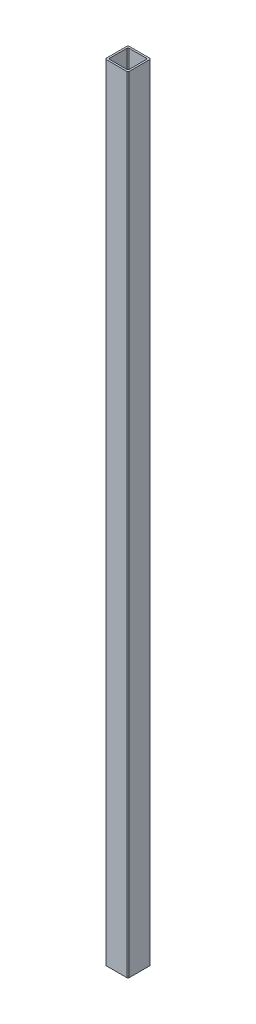
ISO-10303-21;
HEADER;
FILE_DESCRIPTION(('STEP AP214'),'2;1');
FILE_NAME('part.step','',(''),(''),'','','');
FILE_SCHEMA(('AUTOMOTIVE_DESIGN { 1 0 10303 214 1 1 1 1 }'));
ENDSEC;
DATA;
#1=APPLICATION_CONTEXT('core data for automotive mechanical design processes');
#2=APPLICATION_PROTOCOL_DEFINITION('international standard','automotive_design',2000,#1);
#3=PRODUCT_CONTEXT('',#1,'mechanical');
#4=PRODUCT('Part','Part','',(#3));
#5=PRODUCT_RELATED_PRODUCT_CATEGORY('part','',(#4));
#6=PRODUCT_DEFINITION_FORMATION('','',#4);
#7=PRODUCT_DEFINITION_CONTEXT('part definition',#1,'design');
#8=PRODUCT_DEFINITION('design','',#6,#7);
#9=PRODUCT_DEFINITION_SHAPE('','',#8);
#10=(LENGTH_UNIT() NAMED_UNIT(*) SI_UNIT(.MILLI.,.METRE.));
#11=(NAMED_UNIT(*) PLANE_ANGLE_UNIT() SI_UNIT($,.RADIAN.));
#12=(NAMED_UNIT(*) SI_UNIT($,.STERADIAN.) SOLID_ANGLE_UNIT());
#13=UNCERTAINTY_MEASURE_WITH_UNIT(LENGTH_MEASURE(1.E-05),#10,'distance_accuracy_value','');
#14=(GEOMETRIC_REPRESENTATION_CONTEXT(3) GLOBAL_UNCERTAINTY_ASSIGNED_CONTEXT((#13)) GLOBAL_UNIT_ASSIGNED_CONTEXT((#10,
#11,#12)) REPRESENTATION_CONTEXT('',''));
#15=CARTESIAN_POINT('',(0.,0.,0.));
#16=DIRECTION('',(0.,0.,1.));
#17=DIRECTION('',(1.,0.,0.));
#18=AXIS2_PLACEMENT_3D('',#15,#16,#17);
#19=CARTESIAN_POINT('',(-9.,685.,-9.));
#20=DIRECTION('',(0.,-1.,0.));
#21=DIRECTION('',(0.,0.,1.));
#22=AXIS2_PLACEMENT_3D('',#19,#20,#21);
#23=PLANE('',#22);
#24=CARTESIAN_POINT('',(-9.,685.,-9.));
#25=DIRECTION('',(0.,-1.,0.));
#26=DIRECTION('',(0.,0.,1.));
#27=AXIS2_PLACEMENT_3D('',#24,#25,#26);
#28=CIRCLE('',#27,0.999999999999999);
#29=CARTESIAN_POINT('',(-10.,685.,-8.99999999999999));
#30=VERTEX_POINT('',#29);
#31=CARTESIAN_POINT('',(-8.99999999999999,685.,-10.));
#32=VERTEX_POINT('',#31);
#33=EDGE_CURVE('E217',#30,#32,#28,.T.);
#34=ORIENTED_EDGE('',*,*,#33,.F.);
#35=DIRECTION('',(0.,0.,-1.));
#36=VECTOR('',#35,1.);
#37=CARTESIAN_POINT('',(-10.,685.,-8.99999999999999));
#38=LINE('',#37,#36);
#39=CARTESIAN_POINT('',(-10.,685.,8.99999999999999));
#40=VERTEX_POINT('',#39);
#41=EDGE_CURVE('E239',#40,#30,#38,.T.);
#42=ORIENTED_EDGE('',*,*,#41,.F.);
#43=CARTESIAN_POINT('',(-9.,685.,9.));
#44=DIRECTION('',(0.,-1.,0.));
#45=DIRECTION('',(0.,0.,1.));
#46=AXIS2_PLACEMENT_3D('',#43,#44,#45);
#47=CIRCLE('',#46,0.999999999999999);
#48=CARTESIAN_POINT('',(-8.99999999999999,685.,10.));
#49=VERTEX_POINT('',#48);
#50=EDGE_CURVE('E236',#49,#40,#47,.T.);
#51=ORIENTED_EDGE('',*,*,#50,.F.);
#52=DIRECTION('',(-1.,0.,0.));
#53=VECTOR('',#52,1.);
#54=CARTESIAN_POINT('',(-8.99999999999999,685.,10.));
#55=LINE('',#54,#53);
#56=CARTESIAN_POINT('',(8.99999999999999,685.,10.));
#57=VERTEX_POINT('',#56);
#58=EDGE_CURVE('E233',#57,#49,#55,.T.);
#59=ORIENTED_EDGE('',*,*,#58,.F.);
#60=CARTESIAN_POINT('',(9.,685.,9.));
#61=DIRECTION('',(0.,-1.,0.));
#62=DIRECTION('',(0.,0.,1.));
#63=AXIS2_PLACEMENT_3D('',#60,#61,#62);
#64=CIRCLE('',#63,0.999999999999999);
#65=CARTESIAN_POINT('',(10.,685.,8.99999999999999));
#66=VERTEX_POINT('',#65);
#67=EDGE_CURVE('E230',#66,#57,#64,.T.);
#68=ORIENTED_EDGE('',*,*,#67,.F.);
#69=DIRECTION('',(0.,0.,1.));
#70=VECTOR('',#69,1.);
#71=CARTESIAN_POINT('',(10.,685.,-8.99999999999999));
#72=LINE('',#71,#70);
#73=CARTESIAN_POINT('',(10.,685.,-8.99999999999999));
#74=VERTEX_POINT('',#73);
#75=EDGE_CURVE('E227',#74,#66,#72,.T.);
#76=ORIENTED_EDGE('',*,*,#75,.F.);
#77=CARTESIAN_POINT('',(9.,685.,-9.));
#78=DIRECTION('',(0.,-1.,0.));
#79=DIRECTION('',(0.,0.,-1.));
#80=AXIS2_PLACEMENT_3D('',#77,#78,#79);
#81=CIRCLE('',#80,0.999999999999999);
#82=CARTESIAN_POINT('',(8.99999999999999,685.,-10.));
#83=VERTEX_POINT('',#82);
#84=EDGE_CURVE('E224',#83,#74,#81,.T.);
#85=ORIENTED_EDGE('',*,*,#84,.F.);
#86=DIRECTION('',(1.,0.,0.));
#87=VECTOR('',#86,1.);
#88=CARTESIAN_POINT('',(-8.99999999999999,685.,-10.));
#89=LINE('',#88,#87);
#90=EDGE_CURVE('E220',#32,#83,#89,.T.);
#91=ORIENTED_EDGE('',*,*,#90,.F.);
#92=EDGE_LOOP('',(#34,#42,#51,#59,#68,#76,#85,#91));
#93=FACE_BOUND('',#92,.T.);
#94=CARTESIAN_POINT('',(-7.5,685.,-7.5));
#95=DIRECTION('',(0.,-1.,0.));
#96=DIRECTION('',(0.,0.,1.));
#97=AXIS2_PLACEMENT_3D('',#94,#95,#96);
#98=CIRCLE('',#97,1.);
#99=CARTESIAN_POINT('',(-8.5,685.,-7.49999999999999));
#100=VERTEX_POINT('',#99);
#101=CARTESIAN_POINT('',(-7.5,685.,-8.5));
#102=VERTEX_POINT('',#101);
#103=EDGE_CURVE('E152',#100,#102,#98,.T.);
#104=ORIENTED_EDGE('',*,*,#103,.T.);
#105=DIRECTION('',(1.,0.,0.));
#106=VECTOR('',#105,1.);
#107=CARTESIAN_POINT('',(-7.5,685.,-8.5));
#108=LINE('',#107,#106);
#109=CARTESIAN_POINT('',(7.49999999999999,685.,-8.5));
#110=VERTEX_POINT('',#109);
#111=EDGE_CURVE('E161',#102,#110,#108,.T.);
#112=ORIENTED_EDGE('',*,*,#111,.T.);
#113=CARTESIAN_POINT('',(7.5,685.,-7.5));
#114=DIRECTION('',(0.,-1.,0.));
#115=DIRECTION('',(0.,0.,-1.));
#116=AXIS2_PLACEMENT_3D('',#113,#114,#115);
#117=CIRCLE('',#116,1.);
#118=CARTESIAN_POINT('',(8.5,685.,-7.49999999999999));
#119=VERTEX_POINT('',#118);
#120=EDGE_CURVE('E166',#110,#119,#117,.T.);
#121=ORIENTED_EDGE('',*,*,#120,.T.);
#122=DIRECTION('',(0.,0.,1.));
#123=VECTOR('',#122,1.);
#124=CARTESIAN_POINT('',(8.5,685.,-7.49999999999999));
#125=LINE('',#124,#123);
#126=CARTESIAN_POINT('',(8.5,685.,7.49999999999999));
#127=VERTEX_POINT('',#126);
#128=EDGE_CURVE('E178',#119,#127,#125,.T.);
#129=ORIENTED_EDGE('',*,*,#128,.T.);
#130=CARTESIAN_POINT('',(7.5,685.,7.5));
#131=DIRECTION('',(0.,-1.,0.));
#132=DIRECTION('',(0.,0.,1.));
#133=AXIS2_PLACEMENT_3D('',#130,#131,#132);
#134=CIRCLE('',#133,1.);
#135=CARTESIAN_POINT('',(7.49999999999999,685.,8.5));
#136=VERTEX_POINT('',#135);
#137=EDGE_CURVE('E181',#127,#136,#134,.T.);
#138=ORIENTED_EDGE('',*,*,#137,.T.);
#139=DIRECTION('',(-1.,0.,0.));
#140=VECTOR('',#139,1.);
#141=CARTESIAN_POINT('',(-7.5,685.,8.5));
#142=LINE('',#141,#140);
#143=CARTESIAN_POINT('',(-7.5,685.,8.5));
#144=VERTEX_POINT('',#143);
#145=EDGE_CURVE('E184',#136,#144,#142,.T.);
#146=ORIENTED_EDGE('',*,*,#145,.T.);
#147=CARTESIAN_POINT('',(-7.5,685.,7.5));
#148=DIRECTION('',(0.,-1.,0.));
#149=DIRECTION('',(0.,0.,1.));
#150=AXIS2_PLACEMENT_3D('',#147,#148,#149);
#151=CIRCLE('',#150,1.);
#152=CARTESIAN_POINT('',(-8.5,685.,7.49999999999999));
#153=VERTEX_POINT('',#152);
#154=EDGE_CURVE('E187',#144,#153,#151,.T.);
#155=ORIENTED_EDGE('',*,*,#154,.T.);
#156=DIRECTION('',(0.,0.,-1.));
#157=VECTOR('',#156,1.);
#158=CARTESIAN_POINT('',(-8.5,685.,-7.49999999999999));
#159=LINE('',#158,#157);
#160=EDGE_CURVE('E170',#153,#100,#159,.T.);
#161=ORIENTED_EDGE('',*,*,#160,.T.);
#162=EDGE_LOOP('',(#104,#112,#121,#129,#138,#146,#155,#161));
#163=FACE_BOUND('',#162,.T.);
#164=ADVANCED_FACE('F37',(#93,#163),#23,.F.);
#165=CARTESIAN_POINT('',(-9.,0.,-9.));
#166=DIRECTION('',(0.,-1.,0.));
#167=DIRECTION('',(0.,0.,1.));
#168=AXIS2_PLACEMENT_3D('',#165,#166,#167);
#169=PLANE('',#168);
#170=CARTESIAN_POINT('',(-9.,0.,-9.));
#171=DIRECTION('',(0.,-1.,0.));
#172=DIRECTION('',(0.,0.,1.));
#173=AXIS2_PLACEMENT_3D('',#170,#171,#172);
#174=CIRCLE('',#173,0.999999999999999);
#175=CARTESIAN_POINT('',(-10.,0.,-8.99999999999999));
#176=VERTEX_POINT('',#175);
#177=CARTESIAN_POINT('',(-8.99999999999999,0.,-10.));
#178=VERTEX_POINT('',#177);
#179=EDGE_CURVE('E157',#176,#178,#174,.T.);
#180=ORIENTED_EDGE('',*,*,#179,.T.);
#181=DIRECTION('',(1.,0.,0.));
#182=VECTOR('',#181,1.);
#183=CARTESIAN_POINT('',(-8.99999999999999,0.,-10.));
#184=LINE('',#183,#182);
#185=CARTESIAN_POINT('',(8.99999999999999,0.,-10.));
#186=VERTEX_POINT('',#185);
#187=EDGE_CURVE('E245',#178,#186,#184,.T.);
#188=ORIENTED_EDGE('',*,*,#187,.T.);
#189=CARTESIAN_POINT('',(9.,0.,-9.));
#190=DIRECTION('',(0.,-1.,0.));
#191=DIRECTION('',(0.,0.,-1.));
#192=AXIS2_PLACEMENT_3D('',#189,#190,#191);
#193=CIRCLE('',#192,0.999999999999999);
#194=CARTESIAN_POINT('',(10.,0.,-8.99999999999999));
#195=VERTEX_POINT('',#194);
#196=EDGE_CURVE('E248',#186,#195,#193,.T.);
#197=ORIENTED_EDGE('',*,*,#196,.T.);
#198=DIRECTION('',(0.,0.,1.));
#199=VECTOR('',#198,1.);
#200=CARTESIAN_POINT('',(10.,0.,-8.99999999999999));
#201=LINE('',#200,#199);
#202=CARTESIAN_POINT('',(10.,0.,8.99999999999999));
#203=VERTEX_POINT('',#202);
#204=EDGE_CURVE('E251',#195,#203,#201,.T.);
#205=ORIENTED_EDGE('',*,*,#204,.T.);
#206=CARTESIAN_POINT('',(9.,0.,9.));
#207=DIRECTION('',(0.,-1.,0.));
#208=DIRECTION('',(0.,0.,1.));
#209=AXIS2_PLACEMENT_3D('',#206,#207,#208);
#210=CIRCLE('',#209,0.999999999999999);
#211=CARTESIAN_POINT('',(8.99999999999999,0.,10.));
#212=VERTEX_POINT('',#211);
#213=EDGE_CURVE('E254',#203,#212,#210,.T.);
#214=ORIENTED_EDGE('',*,*,#213,.T.);
#215=DIRECTION('',(-1.,0.,0.));
#216=VECTOR('',#215,1.);
#217=CARTESIAN_POINT('',(-8.99999999999999,0.,10.));
#218=LINE('',#217,#216);
#219=CARTESIAN_POINT('',(-8.99999999999999,0.,10.));
#220=VERTEX_POINT('',#219);
#221=EDGE_CURVE('E257',#212,#220,#218,.T.);
#222=ORIENTED_EDGE('',*,*,#221,.T.);
#223=CARTESIAN_POINT('',(-9.,0.,9.));
#224=DIRECTION('',(0.,-1.,0.));
#225=DIRECTION('',(0.,0.,1.));
#226=AXIS2_PLACEMENT_3D('',#223,#224,#225);
#227=CIRCLE('',#226,0.999999999999999);
#228=CARTESIAN_POINT('',(-10.,0.,8.99999999999999));
#229=VERTEX_POINT('',#228);
#230=EDGE_CURVE('E260',#220,#229,#227,.T.);
#231=ORIENTED_EDGE('',*,*,#230,.T.);
#232=DIRECTION('',(0.,0.,-1.));
#233=VECTOR('',#232,1.);
#234=CARTESIAN_POINT('',(-10.,0.,-8.99999999999999));
#235=LINE('',#234,#233);
#236=EDGE_CURVE('E221',#229,#176,#235,.T.);
#237=ORIENTED_EDGE('',*,*,#236,.T.);
#238=EDGE_LOOP('',(#180,#188,#197,#205,#214,#222,#231,#237));
#239=FACE_BOUND('',#238,.T.);
#240=DIRECTION('',(0.,0.,-1.));
#241=VECTOR('',#240,1.);
#242=CARTESIAN_POINT('',(-8.5,0.,-7.49999999999999));
#243=LINE('',#242,#241);
#244=CARTESIAN_POINT('',(-8.5,0.,7.49999999999999));
#245=VERTEX_POINT('',#244);
#246=CARTESIAN_POINT('',(-8.5,0.,-7.49999999999999));
#247=VERTEX_POINT('',#246);
#248=EDGE_CURVE('E171',#245,#247,#243,.T.);
#249=ORIENTED_EDGE('',*,*,#248,.F.);
#250=CARTESIAN_POINT('',(-7.5,0.,7.5));
#251=DIRECTION('',(0.,-1.,0.));
#252=DIRECTION('',(0.,0.,1.));
#253=AXIS2_PLACEMENT_3D('',#250,#251,#252);
#254=CIRCLE('',#253,1.);
#255=CARTESIAN_POINT('',(-7.5,0.,8.5));
#256=VERTEX_POINT('',#255);
#257=EDGE_CURVE('E174',#256,#245,#254,.T.);
#258=ORIENTED_EDGE('',*,*,#257,.F.);
#259=DIRECTION('',(-1.,0.,0.));
#260=VECTOR('',#259,1.);
#261=CARTESIAN_POINT('',(-7.5,0.,8.5));
#262=LINE('',#261,#260);
#263=CARTESIAN_POINT('',(7.49999999999999,0.,8.5));
#264=VERTEX_POINT('',#263);
#265=EDGE_CURVE('E202',#264,#256,#262,.T.);
#266=ORIENTED_EDGE('',*,*,#265,.F.);
#267=CARTESIAN_POINT('',(7.5,0.,7.5));
#268=DIRECTION('',(0.,-1.,0.));
#269=DIRECTION('',(0.,0.,1.));
#270=AXIS2_PLACEMENT_3D('',#267,#268,#269);
#271=CIRCLE('',#270,1.);
#272=CARTESIAN_POINT('',(8.5,0.,7.49999999999999));
#273=VERTEX_POINT('',#272);
#274=EDGE_CURVE('E199',#273,#264,#271,.T.);
#275=ORIENTED_EDGE('',*,*,#274,.F.);
#276=DIRECTION('',(0.,0.,1.));
#277=VECTOR('',#276,1.);
#278=CARTESIAN_POINT('',(8.5,0.,-7.49999999999999));
#279=LINE('',#278,#277);
#280=CARTESIAN_POINT('',(8.5,0.,-7.49999999999999));
#281=VERTEX_POINT('',#280);
#282=EDGE_CURVE('E196',#281,#273,#279,.T.);
#283=ORIENTED_EDGE('',*,*,#282,.F.);
#284=CARTESIAN_POINT('',(7.5,0.,-7.5));
#285=DIRECTION('',(0.,-1.,0.));
#286=DIRECTION('',(0.,0.,-1.));
#287=AXIS2_PLACEMENT_3D('',#284,#285,#286);
#288=CIRCLE('',#287,1.);
#289=CARTESIAN_POINT('',(7.49999999999999,0.,-8.5));
#290=VERTEX_POINT('',#289);
#291=EDGE_CURVE('E193',#290,#281,#288,.T.);
#292=ORIENTED_EDGE('',*,*,#291,.F.);
#293=DIRECTION('',(1.,0.,0.));
#294=VECTOR('',#293,1.);
#295=CARTESIAN_POINT('',(-7.5,0.,-8.5));
#296=LINE('',#295,#294);
#297=CARTESIAN_POINT('',(-7.5,0.,-8.5));
#298=VERTEX_POINT('',#297);
#299=EDGE_CURVE('E191',#298,#290,#296,.T.);
#300=ORIENTED_EDGE('',*,*,#299,.F.);
#301=CARTESIAN_POINT('',(-7.5,0.,-7.5));
#302=DIRECTION('',(0.,-1.,0.));
#303=DIRECTION('',(0.,0.,1.));
#304=AXIS2_PLACEMENT_3D('',#301,#302,#303);
#305=CIRCLE('',#304,1.);
#306=EDGE_CURVE('E153',#247,#298,#305,.T.);
#307=ORIENTED_EDGE('',*,*,#306,.F.);
#308=EDGE_LOOP('',(#249,#258,#266,#275,#283,#292,#300,#307));
#309=FACE_BOUND('',#308,.T.);
#310=ADVANCED_FACE('F285',(#239,#309),#169,.T.);
#311=CARTESIAN_POINT('',(-9.,685.,-9.));
#312=DIRECTION('',(0.,-1.,0.));
#313=DIRECTION('',(0.,0.,1.));
#314=AXIS2_PLACEMENT_3D('',#311,#312,#313);
#315=CYLINDRICAL_SURFACE('',#314,0.999999999999999);
#316=ORIENTED_EDGE('',*,*,#179,.F.);
#317=DIRECTION('',(0.,-1.,0.));
#318=VECTOR('',#317,1.);
#319=CARTESIAN_POINT('',(-10.,685.,-8.99999999999999));
#320=LINE('',#319,#318);
#321=EDGE_CURVE('E242',#30,#176,#320,.T.);
#322=ORIENTED_EDGE('',*,*,#321,.F.);
#323=ORIENTED_EDGE('',*,*,#33,.T.);
#324=DIRECTION('',(0.,-1.,0.));
#325=VECTOR('',#324,1.);
#326=CARTESIAN_POINT('',(-8.99999999999999,685.,-10.));
#327=LINE('',#326,#325);
#328=EDGE_CURVE('E11',#32,#178,#327,.T.);
#329=ORIENTED_EDGE('',*,*,#328,.T.);
#330=EDGE_LOOP('',(#316,#322,#323,#329));
#331=FACE_BOUND('',#330,.T.);
#332=ADVANCED_FACE('F39',(#331),#315,.T.);
#333=CARTESIAN_POINT('',(-8.99999999999999,685.,-10.));
#334=DIRECTION('',(0.,0.,1.));
#335=DIRECTION('',(-1.,0.,0.));
#336=AXIS2_PLACEMENT_3D('',#333,#334,#335);
#337=PLANE('',#336);
#338=ORIENTED_EDGE('',*,*,#187,.F.);
#339=ORIENTED_EDGE('',*,*,#328,.F.);
#340=ORIENTED_EDGE('',*,*,#90,.T.);
#341=DIRECTION('',(0.,-1.,0.));
#342=VECTOR('',#341,1.);
#343=CARTESIAN_POINT('',(8.99999999999999,685.,-10.));
#344=LINE('',#343,#342);
#345=EDGE_CURVE('E45',#83,#186,#344,.T.);
#346=ORIENTED_EDGE('',*,*,#345,.T.);
#347=EDGE_LOOP('',(#338,#339,#340,#346));
#348=FACE_BOUND('',#347,.T.);
#349=ADVANCED_FACE('F278',(#348),#337,.F.);
#350=CARTESIAN_POINT('',(9.,685.,-9.));
#351=DIRECTION('',(0.,-1.,0.));
#352=DIRECTION('',(0.,0.,1.));
#353=AXIS2_PLACEMENT_3D('',#350,#351,#352);
#354=CYLINDRICAL_SURFACE('',#353,0.999999999999999);
#355=ORIENTED_EDGE('',*,*,#196,.F.);
#356=ORIENTED_EDGE('',*,*,#345,.F.);
#357=ORIENTED_EDGE('',*,*,#84,.T.);
#358=DIRECTION('',(0.,-1.,0.));
#359=VECTOR('',#358,1.);
#360=CARTESIAN_POINT('',(10.,685.,-8.99999999999999));
#361=LINE('',#360,#359);
#362=EDGE_CURVE('E274',#74,#195,#361,.T.);
#363=ORIENTED_EDGE('',*,*,#362,.T.);
#364=EDGE_LOOP('',(#355,#356,#357,#363));
#365=FACE_BOUND('',#364,.T.);
#366=ADVANCED_FACE('F282',(#365),#354,.T.);
#367=CARTESIAN_POINT('',(10.,685.,-8.99999999999999));
#368=DIRECTION('',(-1.,0.,0.));
#369=DIRECTION('',(0.,0.,-1.));
#370=AXIS2_PLACEMENT_3D('',#367,#368,#369);
#371=PLANE('',#370);
#372=ORIENTED_EDGE('',*,*,#204,.F.);
#373=ORIENTED_EDGE('',*,*,#362,.F.);
#374=ORIENTED_EDGE('',*,*,#75,.T.);
#375=DIRECTION('',(0.,-1.,0.));
#376=VECTOR('',#375,1.);
#377=CARTESIAN_POINT('',(10.,685.,8.99999999999999));
#378=LINE('',#377,#376);
#379=EDGE_CURVE('E272',#66,#203,#378,.T.);
#380=ORIENTED_EDGE('',*,*,#379,.T.);
#381=EDGE_LOOP('',(#372,#373,#374,#380));
#382=FACE_BOUND('',#381,.T.);
#383=ADVANCED_FACE('F297',(#382),#371,.F.);
#384=CARTESIAN_POINT('',(9.,685.,9.));
#385=DIRECTION('',(0.,-1.,0.));
#386=DIRECTION('',(0.,0.,1.));
#387=AXIS2_PLACEMENT_3D('',#384,#385,#386);
#388=CYLINDRICAL_SURFACE('',#387,0.999999999999999);
#389=ORIENTED_EDGE('',*,*,#213,.F.);
#390=ORIENTED_EDGE('',*,*,#379,.F.);
#391=ORIENTED_EDGE('',*,*,#67,.T.);
#392=DIRECTION('',(0.,-1.,0.));
#393=VECTOR('',#392,1.);
#394=CARTESIAN_POINT('',(8.99999999999999,685.,10.));
#395=LINE('',#394,#393);
#396=EDGE_CURVE('E270',#57,#212,#395,.T.);
#397=ORIENTED_EDGE('',*,*,#396,.T.);
#398=EDGE_LOOP('',(#389,#390,#391,#397));
#399=FACE_BOUND('',#398,.T.);
#400=ADVANCED_FACE('F301',(#399),#388,.T.);
#401=CARTESIAN_POINT('',(-8.99999999999999,685.,10.));
#402=DIRECTION('',(0.,0.,-1.));
#403=DIRECTION('',(1.,0.,0.));
#404=AXIS2_PLACEMENT_3D('',#401,#402,#403);
#405=PLANE('',#404);
#406=ORIENTED_EDGE('',*,*,#221,.F.);
#407=ORIENTED_EDGE('',*,*,#396,.F.);
#408=ORIENTED_EDGE('',*,*,#58,.T.);
#409=DIRECTION('',(0.,-1.,0.));
#410=VECTOR('',#409,1.);
#411=CARTESIAN_POINT('',(-8.99999999999999,685.,10.));
#412=LINE('',#411,#410);
#413=EDGE_CURVE('E268',#49,#220,#412,.T.);
#414=ORIENTED_EDGE('',*,*,#413,.T.);
#415=EDGE_LOOP('',(#406,#407,#408,#414));
#416=FACE_BOUND('',#415,.T.);
#417=ADVANCED_FACE('F303',(#416),#405,.F.);
#418=CARTESIAN_POINT('',(-9.,685.,9.));
#419=DIRECTION('',(0.,-1.,0.));
#420=DIRECTION('',(0.,0.,1.));
#421=AXIS2_PLACEMENT_3D('',#418,#419,#420);
#422=CYLINDRICAL_SURFACE('',#421,0.999999999999999);
#423=ORIENTED_EDGE('',*,*,#230,.F.);
#424=ORIENTED_EDGE('',*,*,#413,.F.);
#425=ORIENTED_EDGE('',*,*,#50,.T.);
#426=DIRECTION('',(0.,-1.,0.));
#427=VECTOR('',#426,1.);
#428=CARTESIAN_POINT('',(-10.,685.,8.99999999999999));
#429=LINE('',#428,#427);
#430=EDGE_CURVE('E266',#40,#229,#429,.T.);
#431=ORIENTED_EDGE('',*,*,#430,.T.);
#432=EDGE_LOOP('',(#423,#424,#425,#431));
#433=FACE_BOUND('',#432,.T.);
#434=ADVANCED_FACE('F307',(#433),#422,.T.);
#435=CARTESIAN_POINT('',(-10.,685.,-8.99999999999999));
#436=DIRECTION('',(1.,0.,0.));
#437=DIRECTION('',(0.,0.,1.));
#438=AXIS2_PLACEMENT_3D('',#435,#436,#437);
#439=PLANE('',#438);
#440=ORIENTED_EDGE('',*,*,#236,.F.);
#441=ORIENTED_EDGE('',*,*,#430,.F.);
#442=ORIENTED_EDGE('',*,*,#41,.T.);
#443=ORIENTED_EDGE('',*,*,#321,.T.);
#444=EDGE_LOOP('',(#440,#441,#442,#443));
#445=FACE_BOUND('',#444,.T.);
#446=ADVANCED_FACE('F309',(#445),#439,.F.);
#447=CARTESIAN_POINT('',(-7.5,685.,-7.5));
#448=DIRECTION('',(0.,-1.,0.));
#449=DIRECTION('',(0.,0.,1.));
#450=AXIS2_PLACEMENT_3D('',#447,#448,#449);
#451=CYLINDRICAL_SURFACE('',#450,1.);
#452=ORIENTED_EDGE('',*,*,#306,.T.);
#453=DIRECTION('',(0.,-1.,0.));
#454=VECTOR('',#453,1.);
#455=CARTESIAN_POINT('',(-7.5,685.,-8.5));
#456=LINE('',#455,#454);
#457=EDGE_CURVE('E148',#102,#298,#456,.T.);
#458=ORIENTED_EDGE('',*,*,#457,.F.);
#459=ORIENTED_EDGE('',*,*,#103,.F.);
#460=DIRECTION('',(0.,-1.,0.));
#461=VECTOR('',#460,1.);
#462=CARTESIAN_POINT('',(-8.5,685.,-7.49999999999999));
#463=LINE('',#462,#461);
#464=EDGE_CURVE('E60',#100,#247,#463,.T.);
#465=ORIENTED_EDGE('',*,*,#464,.T.);
#466=EDGE_LOOP('',(#452,#458,#459,#465));
#467=FACE_BOUND('',#466,.T.);
#468=ADVANCED_FACE('F150',(#467),#451,.F.);
#469=CARTESIAN_POINT('',(-7.5,685.,-8.5));
#470=DIRECTION('',(0.,0.,1.));
#471=DIRECTION('',(-1.,0.,0.));
#472=AXIS2_PLACEMENT_3D('',#469,#470,#471);
#473=PLANE('',#472);
#474=ORIENTED_EDGE('',*,*,#299,.T.);
#475=DIRECTION('',(0.,-1.,0.));
#476=VECTOR('',#475,1.);
#477=CARTESIAN_POINT('',(7.49999999999999,685.,-8.5));
#478=LINE('',#477,#476);
#479=EDGE_CURVE('E158',#110,#290,#478,.T.);
#480=ORIENTED_EDGE('',*,*,#479,.F.);
#481=ORIENTED_EDGE('',*,*,#111,.F.);
#482=ORIENTED_EDGE('',*,*,#457,.T.);
#483=EDGE_LOOP('',(#474,#480,#481,#482));
#484=FACE_BOUND('',#483,.T.);
#485=ADVANCED_FACE('F162',(#484),#473,.T.);
#486=CARTESIAN_POINT('',(7.5,685.,-7.5));
#487=DIRECTION('',(0.,-1.,0.));
#488=DIRECTION('',(0.,0.,1.));
#489=AXIS2_PLACEMENT_3D('',#486,#487,#488);
#490=CYLINDRICAL_SURFACE('',#489,1.);
#491=ORIENTED_EDGE('',*,*,#291,.T.);
#492=DIRECTION('',(0.,-1.,0.));
#493=VECTOR('',#492,1.);
#494=CARTESIAN_POINT('',(8.5,685.,-7.49999999999999));
#495=LINE('',#494,#493);
#496=EDGE_CURVE('E214',#119,#281,#495,.T.);
#497=ORIENTED_EDGE('',*,*,#496,.F.);
#498=ORIENTED_EDGE('',*,*,#120,.F.);
#499=ORIENTED_EDGE('',*,*,#479,.T.);
#500=EDGE_LOOP('',(#491,#497,#498,#499));
#501=FACE_BOUND('',#500,.T.);
#502=ADVANCED_FACE('F327',(#501),#490,.F.);
#503=CARTESIAN_POINT('',(8.5,685.,-7.49999999999999));
#504=DIRECTION('',(-1.,0.,0.));
#505=DIRECTION('',(0.,0.,-1.));
#506=AXIS2_PLACEMENT_3D('',#503,#504,#505);
#507=PLANE('',#506);
#508=ORIENTED_EDGE('',*,*,#282,.T.);
#509=DIRECTION('',(0.,-1.,0.));
#510=VECTOR('',#509,1.);
#511=CARTESIAN_POINT('',(8.5,685.,7.49999999999999));
#512=LINE('',#511,#510);
#513=EDGE_CURVE('E212',#127,#273,#512,.T.);
#514=ORIENTED_EDGE('',*,*,#513,.F.);
#515=ORIENTED_EDGE('',*,*,#128,.F.);
#516=ORIENTED_EDGE('',*,*,#496,.T.);
#517=EDGE_LOOP('',(#508,#514,#515,#516));
#518=FACE_BOUND('',#517,.T.);
#519=ADVANCED_FACE('F330',(#518),#507,.T.);
#520=CARTESIAN_POINT('',(7.5,685.,7.5));
#521=DIRECTION('',(0.,-1.,0.));
#522=DIRECTION('',(0.,0.,1.));
#523=AXIS2_PLACEMENT_3D('',#520,#521,#522);
#524=CYLINDRICAL_SURFACE('',#523,1.);
#525=ORIENTED_EDGE('',*,*,#274,.T.);
#526=DIRECTION('',(0.,-1.,0.));
#527=VECTOR('',#526,1.);
#528=CARTESIAN_POINT('',(7.49999999999999,685.,8.5));
#529=LINE('',#528,#527);
#530=EDGE_CURVE('E210',#136,#264,#529,.T.);
#531=ORIENTED_EDGE('',*,*,#530,.F.);
#532=ORIENTED_EDGE('',*,*,#137,.F.);
#533=ORIENTED_EDGE('',*,*,#513,.T.);
#534=EDGE_LOOP('',(#525,#531,#532,#533));
#535=FACE_BOUND('',#534,.T.);
#536=ADVANCED_FACE('F334',(#535),#524,.F.);
#537=CARTESIAN_POINT('',(-7.5,685.,8.5));
#538=DIRECTION('',(0.,0.,-1.));
#539=DIRECTION('',(1.,0.,0.));
#540=AXIS2_PLACEMENT_3D('',#537,#538,#539);
#541=PLANE('',#540);
#542=ORIENTED_EDGE('',*,*,#265,.T.);
#543=DIRECTION('',(0.,-1.,0.));
#544=VECTOR('',#543,1.);
#545=CARTESIAN_POINT('',(-7.5,685.,8.5));
#546=LINE('',#545,#544);
#547=EDGE_CURVE('E208',#144,#256,#546,.T.);
#548=ORIENTED_EDGE('',*,*,#547,.F.);
#549=ORIENTED_EDGE('',*,*,#145,.F.);
#550=ORIENTED_EDGE('',*,*,#530,.T.);
#551=EDGE_LOOP('',(#542,#548,#549,#550));
#552=FACE_BOUND('',#551,.T.);
#553=ADVANCED_FACE('F338',(#552),#541,.T.);
#554=CARTESIAN_POINT('',(-7.5,685.,7.5));
#555=DIRECTION('',(0.,-1.,0.));
#556=DIRECTION('',(0.,0.,1.));
#557=AXIS2_PLACEMENT_3D('',#554,#555,#556);
#558=CYLINDRICAL_SURFACE('',#557,1.);
#559=ORIENTED_EDGE('',*,*,#257,.T.);
#560=DIRECTION('',(0.,-1.,0.));
#561=VECTOR('',#560,1.);
#562=CARTESIAN_POINT('',(-8.5,685.,7.49999999999999));
#563=LINE('',#562,#561);
#564=EDGE_CURVE('E52',#153,#245,#563,.T.);
#565=ORIENTED_EDGE('',*,*,#564,.F.);
#566=ORIENTED_EDGE('',*,*,#154,.F.);
#567=ORIENTED_EDGE('',*,*,#547,.T.);
#568=EDGE_LOOP('',(#559,#565,#566,#567));
#569=FACE_BOUND('',#568,.T.);
#570=ADVANCED_FACE('F342',(#569),#558,.F.);
#571=CARTESIAN_POINT('',(-8.5,685.,-7.49999999999999));
#572=DIRECTION('',(1.,0.,0.));
#573=DIRECTION('',(0.,0.,1.));
#574=AXIS2_PLACEMENT_3D('',#571,#572,#573);
#575=PLANE('',#574);
#576=ORIENTED_EDGE('',*,*,#248,.T.);
#577=ORIENTED_EDGE('',*,*,#464,.F.);
#578=ORIENTED_EDGE('',*,*,#160,.F.);
#579=ORIENTED_EDGE('',*,*,#564,.T.);
#580=EDGE_LOOP('',(#576,#577,#578,#579));
#581=FACE_BOUND('',#580,.T.);
#582=ADVANCED_FACE('F346',(#581),#575,.T.);
#583=CLOSED_SHELL('',(#164,#310,#332,#349,#366,#383,#400,#417,#434,#446,#468,#485,#502,#519,
#536,#553,#570,#582));
#584=MANIFOLD_SOLID_BREP('B2',#583);
#585=ADVANCED_BREP_SHAPE_REPRESENTATION('',(#18,#584),#14);
#586=SHAPE_DEFINITION_REPRESENTATION(#9,#585);
ENDSEC;
END-ISO-10303-21;
